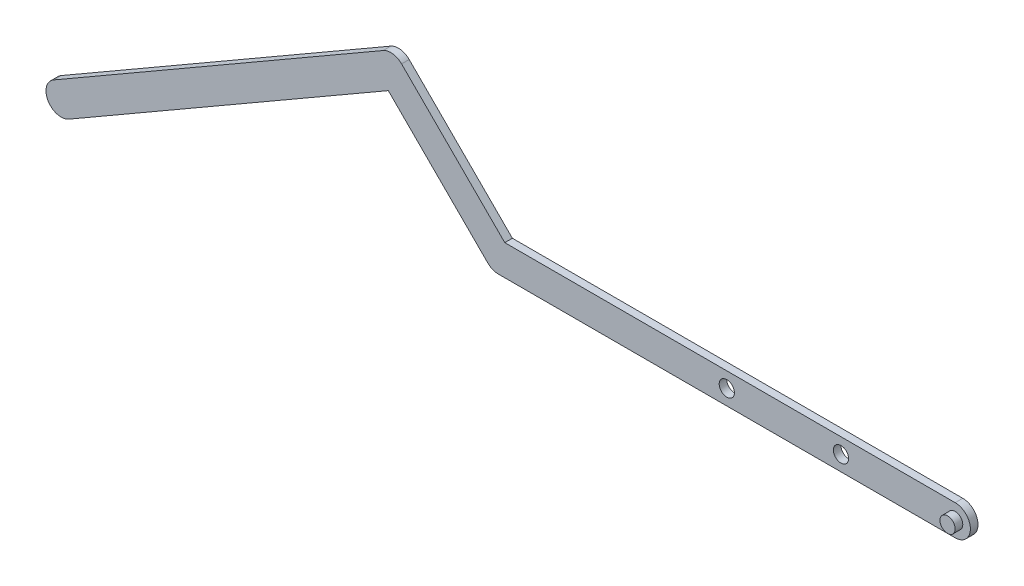
ISO-10303-21;
HEADER;
FILE_DESCRIPTION(('STEP AP214'),'2;1');
FILE_NAME('part.step','',(''),(''),'','','');
FILE_SCHEMA(('AUTOMOTIVE_DESIGN { 1 0 10303 214 1 1 1 1 }'));
ENDSEC;
DATA;
#1=APPLICATION_CONTEXT('core data for automotive mechanical design processes');
#2=APPLICATION_PROTOCOL_DEFINITION('international standard','automotive_design',2000,#1);
#3=PRODUCT_CONTEXT('',#1,'mechanical');
#4=PRODUCT('Part','Part','',(#3));
#5=PRODUCT_RELATED_PRODUCT_CATEGORY('part','',(#4));
#6=PRODUCT_DEFINITION_FORMATION('','',#4);
#7=PRODUCT_DEFINITION_CONTEXT('part definition',#1,'design');
#8=PRODUCT_DEFINITION('design','',#6,#7);
#9=PRODUCT_DEFINITION_SHAPE('','',#8);
#10=(LENGTH_UNIT() NAMED_UNIT(*) SI_UNIT(.MILLI.,.METRE.));
#11=(NAMED_UNIT(*) PLANE_ANGLE_UNIT() SI_UNIT($,.RADIAN.));
#12=(NAMED_UNIT(*) SI_UNIT($,.STERADIAN.) SOLID_ANGLE_UNIT());
#13=UNCERTAINTY_MEASURE_WITH_UNIT(LENGTH_MEASURE(1.E-05),#10,'distance_accuracy_value','');
#14=(GEOMETRIC_REPRESENTATION_CONTEXT(3) GLOBAL_UNCERTAINTY_ASSIGNED_CONTEXT((#13)) GLOBAL_UNIT_ASSIGNED_CONTEXT((#10,
#11,#12)) REPRESENTATION_CONTEXT('',''));
#15=CARTESIAN_POINT('',(0.,0.,0.));
#16=DIRECTION('',(0.,0.,1.));
#17=DIRECTION('',(1.,0.,0.));
#18=AXIS2_PLACEMENT_3D('',#15,#16,#17);
#19=CARTESIAN_POINT('',(-44.1421356237309,14.1421356237309,1.));
#20=DIRECTION('',(0.,0.,1.));
#21=DIRECTION('',(1.,0.,0.));
#22=AXIS2_PLACEMENT_3D('',#19,#20,#21);
#23=PLANE('',#22);
#24=CARTESIAN_POINT('',(30.,0.,1.));
#25=DIRECTION('',(0.,0.,1.));
#26=DIRECTION('',(1.,0.,0.));
#27=AXIS2_PLACEMENT_3D('',#24,#25,#26);
#28=CIRCLE('',#27,1.);
#29=CARTESIAN_POINT('',(31.,0.,1.));
#30=VERTEX_POINT('',#29);
#31=EDGE_CURVE('E264',#30,#30,#28,.T.);
#32=ORIENTED_EDGE('',*,*,#31,.F.);
#33=EDGE_LOOP('',(#32));
#34=FACE_BOUND('',#33,.T.);
#35=CARTESIAN_POINT('',(15.,0.,1.));
#36=DIRECTION('',(0.,0.,1.));
#37=DIRECTION('',(1.,0.,0.));
#38=AXIS2_PLACEMENT_3D('',#35,#36,#37);
#39=CIRCLE('',#38,1.);
#40=CARTESIAN_POINT('',(16.,0.,1.));
#41=VERTEX_POINT('',#40);
#42=EDGE_CURVE('E161',#41,#41,#39,.T.);
#43=ORIENTED_EDGE('',*,*,#42,.F.);
#44=EDGE_LOOP('',(#43));
#45=FACE_BOUND('',#44,.T.);
#46=DIRECTION('',(-1.,0.,0.));
#47=VECTOR('',#46,1.);
#48=CARTESIAN_POINT('',(0.,2.,1.));
#49=LINE('',#48,#47);
#50=CARTESIAN_POINT('',(30.,2.,1.));
#51=VERTEX_POINT('',#50);
#52=CARTESIAN_POINT('',(-29.1715728752538,1.99999999999999,1.));
#53=VERTEX_POINT('',#52);
#54=EDGE_CURVE('E57',#51,#53,#49,.T.);
#55=ORIENTED_EDGE('',*,*,#54,.T.);
#56=DIRECTION('',(-0.707106781186591,0.707106781186504,0.));
#57=VECTOR('',#56,1.);
#58=CARTESIAN_POINT('',(-42.7279220613588,15.5563491861033,1.));
#59=LINE('',#58,#57);
#60=CARTESIAN_POINT('',(-42.7279220613584,15.5563491861037,1.));
#61=VERTEX_POINT('',#60);
#62=EDGE_CURVE('E106',#53,#61,#59,.T.);
#63=ORIENTED_EDGE('',*,*,#62,.T.);
#64=CARTESIAN_POINT('',(-44.1421356237309,14.1421356237309,1.));
#65=DIRECTION('',(0.,0.,1.));
#66=DIRECTION('',(1.,0.,0.));
#67=AXIS2_PLACEMENT_3D('',#64,#65,#66);
#68=CIRCLE('',#67,1.99999999999935);
#69=CARTESIAN_POINT('',(-45.1421356237309,15.8741864312997,1.));
#70=VERTEX_POINT('',#69);
#71=EDGE_CURVE('E213',#61,#70,#68,.T.);
#72=ORIENTED_EDGE('',*,*,#71,.T.);
#73=DIRECTION('',(-0.86602540378444,-0.499999999999997,0.));
#74=VECTOR('',#73,1.);
#75=CARTESIAN_POINT('',(-88.4434058129529,-9.1258135687001,1.));
#76=LINE('',#75,#74);
#77=CARTESIAN_POINT('',(-88.4434058129528,-9.1258135687002,1.));
#78=VERTEX_POINT('',#77);
#79=EDGE_CURVE('E234',#70,#78,#76,.T.);
#80=ORIENTED_EDGE('',*,*,#79,.T.);
#81=CARTESIAN_POINT('',(-87.4434058129529,-10.8578643762691,1.));
#82=DIRECTION('',(0.,0.,1.));
#83=DIRECTION('',(1.,0.,0.));
#84=AXIS2_PLACEMENT_3D('',#81,#82,#83);
#85=CIRCLE('',#84,1.99999999999996);
#86=CARTESIAN_POINT('',(-86.443405812953,-12.5899151838378,1.));
#87=VERTEX_POINT('',#86);
#88=EDGE_CURVE('E230',#78,#87,#85,.T.);
#89=ORIENTED_EDGE('',*,*,#88,.T.);
#90=DIRECTION('',(0.866025403784439,0.499999999999999,0.));
#91=VECTOR('',#90,1.);
#92=CARTESIAN_POINT('',(-44.4711849529293,11.6427578281832,1.));
#93=LINE('',#92,#91);
#94=CARTESIAN_POINT('',(-44.4711849529293,11.6427578281832,1.));
#95=VERTEX_POINT('',#94);
#96=EDGE_CURVE('E233',#87,#95,#93,.T.);
#97=ORIENTED_EDGE('',*,*,#96,.T.);
#98=DIRECTION('',(0.707106781186544,-0.707106781186551,0.));
#99=VECTOR('',#98,1.);
#100=CARTESIAN_POINT('',(-44.4711849529293,11.6427578281832,1.));
#101=LINE('',#100,#99);
#102=CARTESIAN_POINT('',(-31.4142135623731,-1.41421356237309,1.));
#103=VERTEX_POINT('',#102);
#104=EDGE_CURVE('E132',#95,#103,#101,.T.);
#105=ORIENTED_EDGE('',*,*,#104,.T.);
#106=CARTESIAN_POINT('',(-30.,0.,1.));
#107=DIRECTION('',(0.,0.,1.));
#108=DIRECTION('',(1.,0.,0.));
#109=AXIS2_PLACEMENT_3D('',#106,#107,#108);
#110=CIRCLE('',#109,2.);
#111=CARTESIAN_POINT('',(-30.,-2.,1.));
#112=VERTEX_POINT('',#111);
#113=EDGE_CURVE('E126',#103,#112,#110,.T.);
#114=ORIENTED_EDGE('',*,*,#113,.T.);
#115=DIRECTION('',(1.,0.,0.));
#116=VECTOR('',#115,1.);
#117=CARTESIAN_POINT('',(0.,-2.,1.));
#118=LINE('',#117,#116);
#119=CARTESIAN_POINT('',(30.,-2.,1.));
#120=VERTEX_POINT('',#119);
#121=EDGE_CURVE('E130',#112,#120,#118,.T.);
#122=ORIENTED_EDGE('',*,*,#121,.T.);
#123=CARTESIAN_POINT('',(30.,0.,1.));
#124=DIRECTION('',(0.,0.,1.));
#125=DIRECTION('',(1.,0.,0.));
#126=AXIS2_PLACEMENT_3D('',#123,#124,#125);
#127=CIRCLE('',#126,2.);
#128=EDGE_CURVE('E150',#120,#51,#127,.T.);
#129=ORIENTED_EDGE('',*,*,#128,.T.);
#130=EDGE_LOOP('',(#55,#63,#72,#80,#89,#97,#105,#114,#122,#129));
#131=FACE_BOUND('',#130,.T.);
#132=CARTESIAN_POINT('',(0.,0.,1.));
#133=DIRECTION('',(0.,0.,1.));
#134=DIRECTION('',(1.,0.,0.));
#135=AXIS2_PLACEMENT_3D('',#132,#133,#134);
#136=CIRCLE('',#135,1.);
#137=CARTESIAN_POINT('',(1.,0.,1.));
#138=VERTEX_POINT('',#137);
#139=EDGE_CURVE('E252',#138,#138,#136,.T.);
#140=ORIENTED_EDGE('',*,*,#139,.F.);
#141=EDGE_LOOP('',(#140));
#142=FACE_BOUND('',#141,.T.);
#143=ADVANCED_FACE('F39',(#34,#45,#131,#142),#23,.T.);
#144=CARTESIAN_POINT('',(-44.1421356237309,14.1421356237309,0.));
#145=DIRECTION('',(0.,0.,1.));
#146=DIRECTION('',(1.,0.,0.));
#147=AXIS2_PLACEMENT_3D('',#144,#145,#146);
#148=PLANE('',#147);
#149=DIRECTION('',(-0.707106781186591,0.707106781186504,0.));
#150=VECTOR('',#149,1.);
#151=CARTESIAN_POINT('',(-42.7279220613588,15.5563491861033,0.));
#152=LINE('',#151,#150);
#153=CARTESIAN_POINT('',(-29.1715728752538,1.99999999999999,0.));
#154=VERTEX_POINT('',#153);
#155=CARTESIAN_POINT('',(-42.7279220613584,15.5563491861037,0.));
#156=VERTEX_POINT('',#155);
#157=EDGE_CURVE('E157',#154,#156,#152,.T.);
#158=ORIENTED_EDGE('',*,*,#157,.F.);
#159=DIRECTION('',(-1.,0.,0.));
#160=VECTOR('',#159,1.);
#161=CARTESIAN_POINT('',(0.,2.,0.));
#162=LINE('',#161,#160);
#163=CARTESIAN_POINT('',(30.,2.,0.));
#164=VERTEX_POINT('',#163);
#165=EDGE_CURVE('E182',#164,#154,#162,.T.);
#166=ORIENTED_EDGE('',*,*,#165,.F.);
#167=CARTESIAN_POINT('',(30.,0.,0.));
#168=DIRECTION('',(0.,0.,1.));
#169=DIRECTION('',(1.,0.,0.));
#170=AXIS2_PLACEMENT_3D('',#167,#168,#169);
#171=CIRCLE('',#170,2.);
#172=CARTESIAN_POINT('',(30.,-2.,0.));
#173=VERTEX_POINT('',#172);
#174=EDGE_CURVE('E99',#173,#164,#171,.T.);
#175=ORIENTED_EDGE('',*,*,#174,.F.);
#176=DIRECTION('',(1.,0.,0.));
#177=VECTOR('',#176,1.);
#178=CARTESIAN_POINT('',(0.,-2.,0.));
#179=LINE('',#178,#177);
#180=CARTESIAN_POINT('',(-30.,-2.,0.));
#181=VERTEX_POINT('',#180);
#182=EDGE_CURVE('E92',#181,#173,#179,.T.);
#183=ORIENTED_EDGE('',*,*,#182,.F.);
#184=CARTESIAN_POINT('',(-30.,0.,0.));
#185=DIRECTION('',(0.,0.,1.));
#186=DIRECTION('',(1.,0.,0.));
#187=AXIS2_PLACEMENT_3D('',#184,#185,#186);
#188=CIRCLE('',#187,2.);
#189=CARTESIAN_POINT('',(-31.4142135623731,-1.41421356237309,0.));
#190=VERTEX_POINT('',#189);
#191=EDGE_CURVE('E142',#190,#181,#188,.T.);
#192=ORIENTED_EDGE('',*,*,#191,.F.);
#193=DIRECTION('',(0.707106781186544,-0.707106781186551,0.));
#194=VECTOR('',#193,1.);
#195=CARTESIAN_POINT('',(-44.4711849529293,11.6427578281832,0.));
#196=LINE('',#195,#194);
#197=CARTESIAN_POINT('',(-44.4711849529293,11.6427578281832,0.));
#198=VERTEX_POINT('',#197);
#199=EDGE_CURVE('E173',#198,#190,#196,.T.);
#200=ORIENTED_EDGE('',*,*,#199,.F.);
#201=DIRECTION('',(0.866025403784439,0.499999999999999,0.));
#202=VECTOR('',#201,1.);
#203=CARTESIAN_POINT('',(-44.4711849529293,11.6427578281832,0.));
#204=LINE('',#203,#202);
#205=CARTESIAN_POINT('',(-86.443405812953,-12.5899151838378,0.));
#206=VERTEX_POINT('',#205);
#207=EDGE_CURVE('E170',#206,#198,#204,.T.);
#208=ORIENTED_EDGE('',*,*,#207,.F.);
#209=CARTESIAN_POINT('',(-87.4434058129529,-10.8578643762691,0.));
#210=DIRECTION('',(0.,0.,1.));
#211=DIRECTION('',(1.,0.,0.));
#212=AXIS2_PLACEMENT_3D('',#209,#210,#211);
#213=CIRCLE('',#212,1.99999999999996);
#214=CARTESIAN_POINT('',(-88.4434058129528,-9.1258135687002,0.));
#215=VERTEX_POINT('',#214);
#216=EDGE_CURVE('E167',#215,#206,#213,.T.);
#217=ORIENTED_EDGE('',*,*,#216,.F.);
#218=DIRECTION('',(-0.86602540378444,-0.499999999999997,0.));
#219=VECTOR('',#218,1.);
#220=CARTESIAN_POINT('',(-88.4434058129529,-9.1258135687001,0.));
#221=LINE('',#220,#219);
#222=CARTESIAN_POINT('',(-45.1421356237309,15.8741864312997,0.));
#223=VERTEX_POINT('',#222);
#224=EDGE_CURVE('E164',#223,#215,#221,.T.);
#225=ORIENTED_EDGE('',*,*,#224,.F.);
#226=CARTESIAN_POINT('',(-44.1421356237309,14.1421356237309,0.));
#227=DIRECTION('',(0.,0.,1.));
#228=DIRECTION('',(1.,0.,0.));
#229=AXIS2_PLACEMENT_3D('',#226,#227,#228);
#230=CIRCLE('',#229,1.99999999999935);
#231=EDGE_CURVE('E160',#156,#223,#230,.T.);
#232=ORIENTED_EDGE('',*,*,#231,.F.);
#233=EDGE_LOOP('',(#158,#166,#175,#183,#192,#200,#208,#217,#225,#232));
#234=FACE_BOUND('',#233,.T.);
#235=CARTESIAN_POINT('',(15.,0.,0.));
#236=DIRECTION('',(0.,0.,1.));
#237=DIRECTION('',(1.,0.,0.));
#238=AXIS2_PLACEMENT_3D('',#235,#236,#237);
#239=CIRCLE('',#238,1.);
#240=CARTESIAN_POINT('',(16.,0.,0.));
#241=VERTEX_POINT('',#240);
#242=EDGE_CURVE('E248',#241,#241,#239,.T.);
#243=ORIENTED_EDGE('',*,*,#242,.T.);
#244=EDGE_LOOP('',(#243));
#245=FACE_BOUND('',#244,.T.);
#246=CARTESIAN_POINT('',(0.,0.,0.));
#247=DIRECTION('',(0.,0.,1.));
#248=DIRECTION('',(1.,0.,0.));
#249=AXIS2_PLACEMENT_3D('',#246,#247,#248);
#250=CIRCLE('',#249,1.);
#251=CARTESIAN_POINT('',(1.,0.,0.));
#252=VERTEX_POINT('',#251);
#253=EDGE_CURVE('E256',#252,#252,#250,.T.);
#254=ORIENTED_EDGE('',*,*,#253,.T.);
#255=EDGE_LOOP('',(#254));
#256=FACE_BOUND('',#255,.T.);
#257=ADVANCED_FACE('F217',(#234,#245,#256),#148,.F.);
#258=CARTESIAN_POINT('',(-42.7279220613588,15.5563491861033,1.));
#259=DIRECTION('',(-0.707106781186504,-0.707106781186591,0.));
#260=DIRECTION('',(0.707106781186591,-0.707106781186504,0.));
#261=AXIS2_PLACEMENT_3D('',#258,#259,#260);
#262=PLANE('',#261);
#263=ORIENTED_EDGE('',*,*,#157,.T.);
#264=DIRECTION('',(0.,0.,-1.));
#265=VECTOR('',#264,1.);
#266=CARTESIAN_POINT('',(-42.7279220613584,15.5563491861037,1.));
#267=LINE('',#266,#265);
#268=EDGE_CURVE('E49',#61,#156,#267,.T.);
#269=ORIENTED_EDGE('',*,*,#268,.F.);
#270=ORIENTED_EDGE('',*,*,#62,.F.);
#271=DIRECTION('',(0.,0.,-1.));
#272=VECTOR('',#271,1.);
#273=CARTESIAN_POINT('',(-29.1715728752538,1.99999999999999,1.));
#274=LINE('',#273,#272);
#275=EDGE_CURVE('E11',#53,#154,#274,.T.);
#276=ORIENTED_EDGE('',*,*,#275,.T.);
#277=EDGE_LOOP('',(#263,#269,#270,#276));
#278=FACE_BOUND('',#277,.T.);
#279=ADVANCED_FACE('F41',(#278),#262,.F.);
#280=CARTESIAN_POINT('',(-44.1421356237309,14.1421356237309,1.));
#281=DIRECTION('',(0.,0.,-1.));
#282=DIRECTION('',(-1.,0.,0.));
#283=AXIS2_PLACEMENT_3D('',#280,#281,#282);
#284=CYLINDRICAL_SURFACE('',#283,1.99999999999935);
#285=ORIENTED_EDGE('',*,*,#231,.T.);
#286=DIRECTION('',(0.,0.,-1.));
#287=VECTOR('',#286,1.);
#288=CARTESIAN_POINT('',(-45.1421356237309,15.8741864312997,1.));
#289=LINE('',#288,#287);
#290=EDGE_CURVE('E203',#70,#223,#289,.T.);
#291=ORIENTED_EDGE('',*,*,#290,.F.);
#292=ORIENTED_EDGE('',*,*,#71,.F.);
#293=ORIENTED_EDGE('',*,*,#268,.T.);
#294=EDGE_LOOP('',(#285,#291,#292,#293));
#295=FACE_BOUND('',#294,.T.);
#296=ADVANCED_FACE('F211',(#295),#284,.T.);
#297=CARTESIAN_POINT('',(-88.4434058129529,-9.1258135687001,1.));
#298=DIRECTION('',(0.499999999999997,-0.86602540378444,0.));
#299=DIRECTION('',(0.86602540378444,0.499999999999997,0.));
#300=AXIS2_PLACEMENT_3D('',#297,#298,#299);
#301=PLANE('',#300);
#302=ORIENTED_EDGE('',*,*,#224,.T.);
#303=DIRECTION('',(0.,0.,-1.));
#304=VECTOR('',#303,1.);
#305=CARTESIAN_POINT('',(-88.4434058129528,-9.1258135687002,1.));
#306=LINE('',#305,#304);
#307=EDGE_CURVE('E199',#78,#215,#306,.T.);
#308=ORIENTED_EDGE('',*,*,#307,.F.);
#309=ORIENTED_EDGE('',*,*,#79,.F.);
#310=ORIENTED_EDGE('',*,*,#290,.T.);
#311=EDGE_LOOP('',(#302,#308,#309,#310));
#312=FACE_BOUND('',#311,.T.);
#313=ADVANCED_FACE('F224',(#312),#301,.F.);
#314=CARTESIAN_POINT('',(-87.4434058129529,-10.8578643762691,1.));
#315=DIRECTION('',(0.,0.,-1.));
#316=DIRECTION('',(-1.,0.,0.));
#317=AXIS2_PLACEMENT_3D('',#314,#315,#316);
#318=CYLINDRICAL_SURFACE('',#317,1.99999999999996);
#319=ORIENTED_EDGE('',*,*,#216,.T.);
#320=DIRECTION('',(0.,0.,-1.));
#321=VECTOR('',#320,1.);
#322=CARTESIAN_POINT('',(-86.443405812953,-12.5899151838378,1.));
#323=LINE('',#322,#321);
#324=EDGE_CURVE('E195',#87,#206,#323,.T.);
#325=ORIENTED_EDGE('',*,*,#324,.F.);
#326=ORIENTED_EDGE('',*,*,#88,.F.);
#327=ORIENTED_EDGE('',*,*,#307,.T.);
#328=EDGE_LOOP('',(#319,#325,#326,#327));
#329=FACE_BOUND('',#328,.T.);
#330=ADVANCED_FACE('F228',(#329),#318,.T.);
#331=CARTESIAN_POINT('',(-44.4711849529293,11.6427578281832,1.));
#332=DIRECTION('',(-0.499999999999999,0.866025403784439,0.));
#333=DIRECTION('',(-0.866025403784439,-0.499999999999999,0.));
#334=AXIS2_PLACEMENT_3D('',#331,#332,#333);
#335=PLANE('',#334);
#336=ORIENTED_EDGE('',*,*,#207,.T.);
#337=DIRECTION('',(0.,0.,-1.));
#338=VECTOR('',#337,1.);
#339=CARTESIAN_POINT('',(-44.4711849529293,11.6427578281832,1.));
#340=LINE('',#339,#338);
#341=EDGE_CURVE('E191',#95,#198,#340,.T.);
#342=ORIENTED_EDGE('',*,*,#341,.F.);
#343=ORIENTED_EDGE('',*,*,#96,.F.);
#344=ORIENTED_EDGE('',*,*,#324,.T.);
#345=EDGE_LOOP('',(#336,#342,#343,#344));
#346=FACE_BOUND('',#345,.T.);
#347=ADVANCED_FACE('F316',(#346),#335,.F.);
#348=CARTESIAN_POINT('',(-44.4711849529293,11.6427578281832,1.));
#349=DIRECTION('',(0.707106781186551,0.707106781186544,0.));
#350=DIRECTION('',(-0.707106781186544,0.707106781186551,0.));
#351=AXIS2_PLACEMENT_3D('',#348,#349,#350);
#352=PLANE('',#351);
#353=ORIENTED_EDGE('',*,*,#199,.T.);
#354=DIRECTION('',(0.,0.,-1.));
#355=VECTOR('',#354,1.);
#356=CARTESIAN_POINT('',(-31.4142135623731,-1.41421356237309,1.));
#357=LINE('',#356,#355);
#358=EDGE_CURVE('E144',#103,#190,#357,.T.);
#359=ORIENTED_EDGE('',*,*,#358,.F.);
#360=ORIENTED_EDGE('',*,*,#104,.F.);
#361=ORIENTED_EDGE('',*,*,#341,.T.);
#362=EDGE_LOOP('',(#353,#359,#360,#361));
#363=FACE_BOUND('',#362,.T.);
#364=ADVANCED_FACE('F313',(#363),#352,.F.);
#365=CARTESIAN_POINT('',(-30.,0.,1.));
#366=DIRECTION('',(0.,0.,-1.));
#367=DIRECTION('',(-1.,0.,0.));
#368=AXIS2_PLACEMENT_3D('',#365,#366,#367);
#369=CYLINDRICAL_SURFACE('',#368,2.);
#370=ORIENTED_EDGE('',*,*,#191,.T.);
#371=DIRECTION('',(0.,0.,-1.));
#372=VECTOR('',#371,1.);
#373=CARTESIAN_POINT('',(-30.,-2.,1.));
#374=LINE('',#373,#372);
#375=EDGE_CURVE('E139',#112,#181,#374,.T.);
#376=ORIENTED_EDGE('',*,*,#375,.F.);
#377=ORIENTED_EDGE('',*,*,#113,.F.);
#378=ORIENTED_EDGE('',*,*,#358,.T.);
#379=EDGE_LOOP('',(#370,#376,#377,#378));
#380=FACE_BOUND('',#379,.T.);
#381=ADVANCED_FACE('F140',(#380),#369,.T.);
#382=CARTESIAN_POINT('',(0.,-2.,1.));
#383=DIRECTION('',(0.,1.,0.));
#384=DIRECTION('',(0.,0.,1.));
#385=AXIS2_PLACEMENT_3D('',#382,#383,#384);
#386=PLANE('',#385);
#387=ORIENTED_EDGE('',*,*,#182,.T.);
#388=DIRECTION('',(0.,0.,-1.));
#389=VECTOR('',#388,1.);
#390=CARTESIAN_POINT('',(30.,-2.,1.));
#391=LINE('',#390,#389);
#392=EDGE_CURVE('E145',#120,#173,#391,.T.);
#393=ORIENTED_EDGE('',*,*,#392,.F.);
#394=ORIENTED_EDGE('',*,*,#121,.F.);
#395=ORIENTED_EDGE('',*,*,#375,.T.);
#396=EDGE_LOOP('',(#387,#393,#394,#395));
#397=FACE_BOUND('',#396,.T.);
#398=ADVANCED_FACE('F147',(#397),#386,.F.);
#399=CARTESIAN_POINT('',(30.,0.,1.));
#400=DIRECTION('',(0.,0.,-1.));
#401=DIRECTION('',(-1.,0.,0.));
#402=AXIS2_PLACEMENT_3D('',#399,#400,#401);
#403=CYLINDRICAL_SURFACE('',#402,2.);
#404=ORIENTED_EDGE('',*,*,#174,.T.);
#405=DIRECTION('',(0.,0.,-1.));
#406=VECTOR('',#405,1.);
#407=CARTESIAN_POINT('',(30.,2.,1.));
#408=LINE('',#407,#406);
#409=EDGE_CURVE('E153',#51,#164,#408,.T.);
#410=ORIENTED_EDGE('',*,*,#409,.F.);
#411=ORIENTED_EDGE('',*,*,#128,.F.);
#412=ORIENTED_EDGE('',*,*,#392,.T.);
#413=EDGE_LOOP('',(#404,#410,#411,#412));
#414=FACE_BOUND('',#413,.T.);
#415=ADVANCED_FACE('F306',(#414),#403,.T.);
#416=CARTESIAN_POINT('',(0.,2.,1.));
#417=DIRECTION('',(0.,-1.,0.));
#418=DIRECTION('',(0.,0.,-1.));
#419=AXIS2_PLACEMENT_3D('',#416,#417,#418);
#420=PLANE('',#419);
#421=ORIENTED_EDGE('',*,*,#165,.T.);
#422=ORIENTED_EDGE('',*,*,#275,.F.);
#423=ORIENTED_EDGE('',*,*,#54,.F.);
#424=ORIENTED_EDGE('',*,*,#409,.T.);
#425=EDGE_LOOP('',(#421,#422,#423,#424));
#426=FACE_BOUND('',#425,.T.);
#427=ADVANCED_FACE('F289',(#426),#420,.F.);
#428=CARTESIAN_POINT('',(15.,0.,1.));
#429=DIRECTION('',(0.,0.,-1.));
#430=DIRECTION('',(-1.,0.,0.));
#431=AXIS2_PLACEMENT_3D('',#428,#429,#430);
#432=CYLINDRICAL_SURFACE('',#431,1.);
#433=ORIENTED_EDGE('',*,*,#42,.T.);
#434=EDGE_LOOP('',(#433));
#435=FACE_BOUND('',#434,.T.);
#436=ORIENTED_EDGE('',*,*,#242,.F.);
#437=EDGE_LOOP('',(#436));
#438=FACE_BOUND('',#437,.T.);
#439=ADVANCED_FACE('F286',(#435,#438),#432,.F.);
#440=CARTESIAN_POINT('',(0.,0.,1.));
#441=DIRECTION('',(0.,0.,-1.));
#442=DIRECTION('',(-1.,0.,0.));
#443=AXIS2_PLACEMENT_3D('',#440,#441,#442);
#444=CYLINDRICAL_SURFACE('',#443,1.);
#445=ORIENTED_EDGE('',*,*,#139,.T.);
#446=EDGE_LOOP('',(#445));
#447=FACE_BOUND('',#446,.T.);
#448=ORIENTED_EDGE('',*,*,#253,.F.);
#449=EDGE_LOOP('',(#448));
#450=FACE_BOUND('',#449,.T.);
#451=ADVANCED_FACE('F277',(#447,#450),#444,.F.);
#452=CARTESIAN_POINT('',(30.,0.,2.));
#453=DIRECTION('',(0.,0.,-1.));
#454=DIRECTION('',(-1.,0.,0.));
#455=AXIS2_PLACEMENT_3D('',#452,#453,#454);
#456=CYLINDRICAL_SURFACE('',#455,1.);
#457=CARTESIAN_POINT('',(30.,0.,2.));
#458=DIRECTION('',(0.,0.,1.));
#459=DIRECTION('',(1.,0.,0.));
#460=AXIS2_PLACEMENT_3D('',#457,#458,#459);
#461=CIRCLE('',#460,1.);
#462=CARTESIAN_POINT('',(31.,0.,2.));
#463=VERTEX_POINT('',#462);
#464=EDGE_CURVE('E260',#463,#463,#461,.T.);
#465=ORIENTED_EDGE('',*,*,#464,.F.);
#466=EDGE_LOOP('',(#465));
#467=FACE_BOUND('',#466,.T.);
#468=ORIENTED_EDGE('',*,*,#31,.T.);
#469=EDGE_LOOP('',(#468));
#470=FACE_BOUND('',#469,.T.);
#471=ADVANCED_FACE('F274',(#467,#470),#456,.T.);
#472=CARTESIAN_POINT('',(30.,0.,2.));
#473=DIRECTION('',(0.,0.,1.));
#474=DIRECTION('',(1.,0.,0.));
#475=AXIS2_PLACEMENT_3D('',#472,#473,#474);
#476=PLANE('',#475);
#477=ORIENTED_EDGE('',*,*,#464,.T.);
#478=EDGE_LOOP('',(#477));
#479=FACE_BOUND('',#478,.T.);
#480=ADVANCED_FACE('F272',(#479),#476,.T.);
#481=CLOSED_SHELL('',(#143,#257,#279,#296,#313,#330,#347,#364,#381,#398,#415,#427,#439,#451,
#471,#480));
#482=MANIFOLD_SOLID_BREP('B2',#481);
#483=ADVANCED_BREP_SHAPE_REPRESENTATION('',(#18,#482),#14);
#484=SHAPE_DEFINITION_REPRESENTATION(#9,#483);
ENDSEC;
END-ISO-10303-21;
